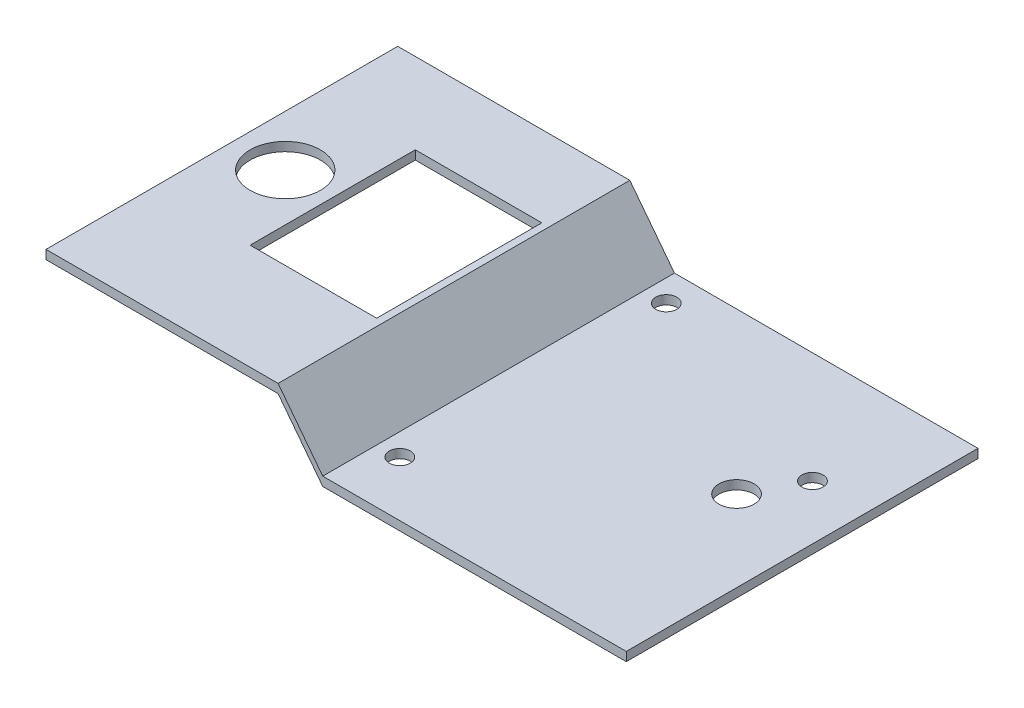
ISO-10303-21;
HEADER;
FILE_DESCRIPTION(('STEP AP214'),'2;1');
FILE_NAME('part.step','',(''),(''),'','','');
FILE_SCHEMA(('AUTOMOTIVE_DESIGN { 1 0 10303 214 1 1 1 1 }'));
ENDSEC;
DATA;
#1=APPLICATION_CONTEXT('core data for automotive mechanical design processes');
#2=APPLICATION_PROTOCOL_DEFINITION('international standard','automotive_design',2000,#1);
#3=PRODUCT_CONTEXT('',#1,'mechanical');
#4=PRODUCT('Part','Part','',(#3));
#5=PRODUCT_RELATED_PRODUCT_CATEGORY('part','',(#4));
#6=PRODUCT_DEFINITION_FORMATION('','',#4);
#7=PRODUCT_DEFINITION_CONTEXT('part definition',#1,'design');
#8=PRODUCT_DEFINITION('design','',#6,#7);
#9=PRODUCT_DEFINITION_SHAPE('','',#8);
#10=(LENGTH_UNIT() NAMED_UNIT(*) SI_UNIT(.MILLI.,.METRE.));
#11=(NAMED_UNIT(*) PLANE_ANGLE_UNIT() SI_UNIT($,.RADIAN.));
#12=(NAMED_UNIT(*) SI_UNIT($,.STERADIAN.) SOLID_ANGLE_UNIT());
#13=UNCERTAINTY_MEASURE_WITH_UNIT(LENGTH_MEASURE(1.E-05),#10,'distance_accuracy_value','');
#14=(GEOMETRIC_REPRESENTATION_CONTEXT(3) GLOBAL_UNCERTAINTY_ASSIGNED_CONTEXT((#13)) GLOBAL_UNIT_ASSIGNED_CONTEXT((#10,
#11,#12)) REPRESENTATION_CONTEXT('',''));
#15=CARTESIAN_POINT('',(0.,0.,0.));
#16=DIRECTION('',(0.,0.,1.));
#17=DIRECTION('',(1.,0.,0.));
#18=AXIS2_PLACEMENT_3D('',#15,#16,#17);
#19=CARTESIAN_POINT('',(0.,-13.97,99.06));
#20=DIRECTION('',(0.,-1.,0.));
#21=DIRECTION('',(0.,0.,-1.));
#22=AXIS2_PLACEMENT_3D('',#19,#20,#21);
#23=PLANE('',#22);
#24=CARTESIAN_POINT('',(149.6,-13.97,30.584));
#25=DIRECTION('',(0.,-1.,0.));
#26=DIRECTION('',(0.,0.,-1.));
#27=AXIS2_PLACEMENT_3D('',#24,#25,#26);
#28=CIRCLE('',#27,2.99999999999999);
#29=CARTESIAN_POINT('',(149.6,-13.97,33.584));
#30=VERTEX_POINT('',#29);
#31=EDGE_CURVE('E163',#30,#30,#28,.T.);
#32=ORIENTED_EDGE('',*,*,#31,.T.);
#33=EDGE_LOOP('',(#32));
#34=FACE_BOUND('',#33,.T.);
#35=CARTESIAN_POINT('',(85.,-13.97,83.384));
#36=DIRECTION('',(0.,-1.,0.));
#37=DIRECTION('',(0.,0.,-1.));
#38=AXIS2_PLACEMENT_3D('',#35,#36,#37);
#39=CIRCLE('',#38,3.00000000000001);
#40=CARTESIAN_POINT('',(85.,-13.97,86.384));
#41=VERTEX_POINT('',#40);
#42=EDGE_CURVE('E160',#41,#41,#39,.T.);
#43=ORIENTED_EDGE('',*,*,#42,.T.);
#44=EDGE_LOOP('',(#43));
#45=FACE_BOUND('',#44,.T.);
#46=CARTESIAN_POINT('',(85.,-13.97,7.58399999999999));
#47=DIRECTION('',(0.,-1.,0.));
#48=DIRECTION('',(0.,0.,-1.));
#49=AXIS2_PLACEMENT_3D('',#46,#47,#48);
#50=CIRCLE('',#49,3.00000000000001);
#51=CARTESIAN_POINT('',(85.,-13.97,10.584));
#52=VERTEX_POINT('',#51);
#53=EDGE_CURVE('E157',#52,#52,#50,.T.);
#54=ORIENTED_EDGE('',*,*,#53,.T.);
#55=EDGE_LOOP('',(#54));
#56=FACE_BOUND('',#55,.T.);
#57=CARTESIAN_POINT('',(142.,-13.97,44.584));
#58=DIRECTION('',(0.,-1.,0.));
#59=DIRECTION('',(0.,0.,-1.));
#60=AXIS2_PLACEMENT_3D('',#57,#58,#59);
#61=CIRCLE('',#60,4.99999999999999);
#62=CARTESIAN_POINT('',(142.,-13.97,49.584));
#63=VERTEX_POINT('',#62);
#64=EDGE_CURVE('E152',#63,#63,#61,.T.);
#65=ORIENTED_EDGE('',*,*,#64,.T.);
#66=EDGE_LOOP('',(#65));
#67=FACE_BOUND('',#66,.T.);
#68=DIRECTION('',(0.,0.,-1.));
#69=VECTOR('',#68,1.);
#70=CARTESIAN_POINT('',(165.1,-13.97,99.06));
#71=LINE('',#70,#69);
#72=CARTESIAN_POINT('',(165.1,-13.97,99.06));
#73=VERTEX_POINT('',#72);
#74=CARTESIAN_POINT('',(165.1,-13.97,-1.016));
#75=VERTEX_POINT('',#74);
#76=EDGE_CURVE('E209',#73,#75,#71,.T.);
#77=ORIENTED_EDGE('',*,*,#76,.T.);
#78=DIRECTION('',(-1.,0.,0.));
#79=VECTOR('',#78,1.);
#80=CARTESIAN_POINT('',(0.,-13.97,-1.016));
#81=LINE('',#80,#79);
#82=CARTESIAN_POINT('',(78.74,-13.97,-1.016));
#83=VERTEX_POINT('',#82);
#84=EDGE_CURVE('E166',#75,#83,#81,.T.);
#85=ORIENTED_EDGE('',*,*,#84,.T.);
#86=DIRECTION('',(0.,0.,-1.));
#87=VECTOR('',#86,1.);
#88=CARTESIAN_POINT('',(78.74,-13.97,99.06));
#89=LINE('',#88,#87);
#90=CARTESIAN_POINT('',(78.74,-13.97,99.06));
#91=VERTEX_POINT('',#90);
#92=EDGE_CURVE('E223',#91,#83,#89,.T.);
#93=ORIENTED_EDGE('',*,*,#92,.F.);
#94=DIRECTION('',(-1.,0.,0.));
#95=VECTOR('',#94,1.);
#96=CARTESIAN_POINT('',(0.,-13.97,99.06));
#97=LINE('',#96,#95);
#98=EDGE_CURVE('E190',#73,#91,#97,.T.);
#99=ORIENTED_EDGE('',*,*,#98,.F.);
#100=EDGE_LOOP('',(#77,#85,#93,#99));
#101=FACE_BOUND('',#100,.T.);
#102=ADVANCED_FACE('F37',(#34,#45,#56,#67,#101),#23,.F.);
#103=CARTESIAN_POINT('',(42.7173234200743,32.8594795539033,99.06));
#104=DIRECTION('',(-0.7926239891046,-0.609710760849692,0.));
#105=DIRECTION('',(0.609710760849692,-0.7926239891046,0.));
#106=AXIS2_PLACEMENT_3D('',#103,#104,#105);
#107=PLANE('',#106);
#108=ORIENTED_EDGE('',*,*,#92,.T.);
#109=DIRECTION('',(-0.609710760849692,0.7926239891046,0.));
#110=VECTOR('',#109,1.);
#111=CARTESIAN_POINT('',(42.7173234200743,32.8594795539033,-1.016));
#112=LINE('',#111,#110);
#113=CARTESIAN_POINT('',(66.04,2.54,-1.016));
#114=VERTEX_POINT('',#113);
#115=EDGE_CURVE('E169',#83,#114,#112,.T.);
#116=ORIENTED_EDGE('',*,*,#115,.T.);
#117=DIRECTION('',(0.,0.,-1.));
#118=VECTOR('',#117,1.);
#119=CARTESIAN_POINT('',(66.04,2.54,99.06));
#120=LINE('',#119,#118);
#121=CARTESIAN_POINT('',(66.04,2.54,99.06));
#122=VERTEX_POINT('',#121);
#123=EDGE_CURVE('E221',#122,#114,#120,.T.);
#124=ORIENTED_EDGE('',*,*,#123,.F.);
#125=DIRECTION('',(-0.609710760849692,0.7926239891046,0.));
#126=VECTOR('',#125,1.);
#127=CARTESIAN_POINT('',(42.7173234200743,32.8594795539033,99.06));
#128=LINE('',#127,#126);
#129=EDGE_CURVE('E193',#91,#122,#128,.T.);
#130=ORIENTED_EDGE('',*,*,#129,.F.);
#131=EDGE_LOOP('',(#108,#116,#124,#130));
#132=FACE_BOUND('',#131,.T.);
#133=ADVANCED_FACE('F250',(#132),#107,.F.);
#134=CARTESIAN_POINT('',(0.,2.54,99.06));
#135=DIRECTION('',(0.,1.,0.));
#136=DIRECTION('',(0.,0.,1.));
#137=AXIS2_PLACEMENT_3D('',#134,#135,#136);
#138=PLANE('',#137);
#139=CARTESIAN_POINT('',(14.5,2.54,45.484));
#140=DIRECTION('',(0.,1.,0.));
#141=DIRECTION('',(0.,0.,1.));
#142=AXIS2_PLACEMENT_3D('',#139,#140,#141);
#143=CIRCLE('',#142,10.);
#144=CARTESIAN_POINT('',(14.5,2.54,55.484));
#145=VERTEX_POINT('',#144);
#146=EDGE_CURVE('E456',#145,#145,#143,.T.);
#147=ORIENTED_EDGE('',*,*,#146,.F.);
#148=EDGE_LOOP('',(#147));
#149=FACE_BOUND('',#148,.T.);
#150=DIRECTION('',(0.,0.,-1.));
#151=VECTOR('',#150,1.);
#152=CARTESIAN_POINT('',(64.,2.54,68.984));
#153=LINE('',#152,#151);
#154=CARTESIAN_POINT('',(64.,2.54,68.984));
#155=VERTEX_POINT('',#154);
#156=CARTESIAN_POINT('',(64.,2.54,21.984));
#157=VERTEX_POINT('',#156);
#158=EDGE_CURVE('E52',#155,#157,#153,.T.);
#159=ORIENTED_EDGE('',*,*,#158,.F.);
#160=DIRECTION('',(1.,0.,0.));
#161=VECTOR('',#160,1.);
#162=CARTESIAN_POINT('',(28.,2.54,68.984));
#163=LINE('',#162,#161);
#164=CARTESIAN_POINT('',(28.,2.54,68.984));
#165=VERTEX_POINT('',#164);
#166=EDGE_CURVE('E145',#165,#155,#163,.T.);
#167=ORIENTED_EDGE('',*,*,#166,.F.);
#168=DIRECTION('',(0.,0.,1.));
#169=VECTOR('',#168,1.);
#170=CARTESIAN_POINT('',(28.,2.54,68.984));
#171=LINE('',#170,#169);
#172=CARTESIAN_POINT('',(28.,2.54,21.984));
#173=VERTEX_POINT('',#172);
#174=EDGE_CURVE('E129',#173,#165,#171,.T.);
#175=ORIENTED_EDGE('',*,*,#174,.F.);
#176=DIRECTION('',(-1.,0.,0.));
#177=VECTOR('',#176,1.);
#178=CARTESIAN_POINT('',(28.,2.54,21.984));
#179=LINE('',#178,#177);
#180=EDGE_CURVE('E138',#157,#173,#179,.T.);
#181=ORIENTED_EDGE('',*,*,#180,.F.);
#182=EDGE_LOOP('',(#159,#167,#175,#181));
#183=FACE_BOUND('',#182,.T.);
#184=ORIENTED_EDGE('',*,*,#123,.T.);
#185=DIRECTION('',(1.,0.,0.));
#186=VECTOR('',#185,1.);
#187=CARTESIAN_POINT('',(0.,2.54,-1.016));
#188=LINE('',#187,#186);
#189=CARTESIAN_POINT('',(0.,2.54,-1.016));
#190=VERTEX_POINT('',#189);
#191=EDGE_CURVE('E172',#190,#114,#188,.T.);
#192=ORIENTED_EDGE('',*,*,#191,.F.);
#193=DIRECTION('',(0.,0.,-1.));
#194=VECTOR('',#193,1.);
#195=CARTESIAN_POINT('',(0.,2.54,99.06));
#196=LINE('',#195,#194);
#197=CARTESIAN_POINT('',(0.,2.54,99.06));
#198=VERTEX_POINT('',#197);
#199=EDGE_CURVE('E219',#198,#190,#196,.T.);
#200=ORIENTED_EDGE('',*,*,#199,.F.);
#201=DIRECTION('',(1.,0.,0.));
#202=VECTOR('',#201,1.);
#203=CARTESIAN_POINT('',(0.,2.54,99.06));
#204=LINE('',#203,#202);
#205=EDGE_CURVE('E195',#198,#122,#204,.T.);
#206=ORIENTED_EDGE('',*,*,#205,.T.);
#207=EDGE_LOOP('',(#184,#192,#200,#206));
#208=FACE_BOUND('',#207,.T.);
#209=ADVANCED_FACE('F142',(#149,#183,#208),#138,.T.);
#210=CARTESIAN_POINT('',(0.,0.,99.06));
#211=DIRECTION('',(-1.,0.,0.));
#212=DIRECTION('',(0.,0.,1.));
#213=AXIS2_PLACEMENT_3D('',#210,#211,#212);
#214=PLANE('',#213);
#215=ORIENTED_EDGE('',*,*,#199,.T.);
#216=DIRECTION('',(0.,1.,0.));
#217=VECTOR('',#216,1.);
#218=CARTESIAN_POINT('',(0.,0.,-1.016));
#219=LINE('',#218,#217);
#220=CARTESIAN_POINT('',(0.,0.,-1.016));
#221=VERTEX_POINT('',#220);
#222=EDGE_CURVE('E175',#221,#190,#219,.T.);
#223=ORIENTED_EDGE('',*,*,#222,.F.);
#224=DIRECTION('',(0.,0.,-1.));
#225=VECTOR('',#224,1.);
#226=CARTESIAN_POINT('',(0.,0.,99.06));
#227=LINE('',#226,#225);
#228=CARTESIAN_POINT('',(0.,0.,99.06));
#229=VERTEX_POINT('',#228);
#230=EDGE_CURVE('E217',#229,#221,#227,.T.);
#231=ORIENTED_EDGE('',*,*,#230,.F.);
#232=DIRECTION('',(0.,1.,0.));
#233=VECTOR('',#232,1.);
#234=CARTESIAN_POINT('',(0.,0.,99.06));
#235=LINE('',#234,#233);
#236=EDGE_CURVE('E198',#229,#198,#235,.T.);
#237=ORIENTED_EDGE('',*,*,#236,.T.);
#238=EDGE_LOOP('',(#215,#223,#231,#237));
#239=FACE_BOUND('',#238,.T.);
#240=ADVANCED_FACE('F296',(#239),#214,.T.);
#241=CARTESIAN_POINT('',(0.,0.,99.06));
#242=DIRECTION('',(0.,1.,0.));
#243=DIRECTION('',(0.,0.,1.));
#244=AXIS2_PLACEMENT_3D('',#241,#242,#243);
#245=PLANE('',#244);
#246=CARTESIAN_POINT('',(14.5,0.,45.484));
#247=DIRECTION('',(0.,1.,0.));
#248=DIRECTION('',(0.,0.,1.));
#249=AXIS2_PLACEMENT_3D('',#246,#247,#248);
#250=CIRCLE('',#249,10.);
#251=CARTESIAN_POINT('',(14.5,0.,55.484));
#252=VERTEX_POINT('',#251);
#253=EDGE_CURVE('E40',#252,#252,#250,.T.);
#254=ORIENTED_EDGE('',*,*,#253,.T.);
#255=EDGE_LOOP('',(#254));
#256=FACE_BOUND('',#255,.T.);
#257=DIRECTION('',(1.,0.,0.));
#258=VECTOR('',#257,1.);
#259=CARTESIAN_POINT('',(0.,0.,68.984));
#260=LINE('',#259,#258);
#261=CARTESIAN_POINT('',(28.,0.,68.984));
#262=VERTEX_POINT('',#261);
#263=CARTESIAN_POINT('',(64.,0.,68.984));
#264=VERTEX_POINT('',#263);
#265=EDGE_CURVE('E45',#262,#264,#260,.T.);
#266=ORIENTED_EDGE('',*,*,#265,.T.);
#267=DIRECTION('',(0.,0.,-1.));
#268=VECTOR('',#267,1.);
#269=CARTESIAN_POINT('',(64.,0.,99.06));
#270=LINE('',#269,#268);
#271=CARTESIAN_POINT('',(64.,0.,21.984));
#272=VERTEX_POINT('',#271);
#273=EDGE_CURVE('E11',#264,#272,#270,.T.);
#274=ORIENTED_EDGE('',*,*,#273,.T.);
#275=DIRECTION('',(-1.,0.,0.));
#276=VECTOR('',#275,1.);
#277=CARTESIAN_POINT('',(0.,0.,21.984));
#278=LINE('',#277,#276);
#279=CARTESIAN_POINT('',(28.,0.,21.984));
#280=VERTEX_POINT('',#279);
#281=EDGE_CURVE('E225',#272,#280,#278,.T.);
#282=ORIENTED_EDGE('',*,*,#281,.T.);
#283=DIRECTION('',(0.,0.,1.));
#284=VECTOR('',#283,1.);
#285=CARTESIAN_POINT('',(28.,0.,99.06));
#286=LINE('',#285,#284);
#287=EDGE_CURVE('E132',#280,#262,#286,.T.);
#288=ORIENTED_EDGE('',*,*,#287,.T.);
#289=EDGE_LOOP('',(#266,#274,#282,#288));
#290=FACE_BOUND('',#289,.T.);
#291=ORIENTED_EDGE('',*,*,#230,.T.);
#292=DIRECTION('',(1.,0.,0.));
#293=VECTOR('',#292,1.);
#294=CARTESIAN_POINT('',(0.,0.,-1.016));
#295=LINE('',#294,#293);
#296=CARTESIAN_POINT('',(66.04,0.,-1.016));
#297=VERTEX_POINT('',#296);
#298=EDGE_CURVE('E178',#221,#297,#295,.T.);
#299=ORIENTED_EDGE('',*,*,#298,.T.);
#300=DIRECTION('',(0.,0.,-1.));
#301=VECTOR('',#300,1.);
#302=CARTESIAN_POINT('',(66.04,0.,99.06));
#303=LINE('',#302,#301);
#304=CARTESIAN_POINT('',(66.04,0.,99.06));
#305=VERTEX_POINT('',#304);
#306=EDGE_CURVE('E215',#305,#297,#303,.T.);
#307=ORIENTED_EDGE('',*,*,#306,.F.);
#308=DIRECTION('',(1.,0.,0.));
#309=VECTOR('',#308,1.);
#310=CARTESIAN_POINT('',(0.,0.,99.06));
#311=LINE('',#310,#309);
#312=EDGE_CURVE('E201',#229,#305,#311,.T.);
#313=ORIENTED_EDGE('',*,*,#312,.F.);
#314=EDGE_LOOP('',(#291,#299,#307,#313));
#315=FACE_BOUND('',#314,.T.);
#316=ADVANCED_FACE('F230',(#256,#290,#315),#245,.F.);
#317=CARTESIAN_POINT('',(41.489814126394,31.9152416356877,99.06));
#318=DIRECTION('',(0.7926239891046,0.609710760849692,0.));
#319=DIRECTION('',(-0.609710760849692,0.7926239891046,0.));
#320=AXIS2_PLACEMENT_3D('',#317,#318,#319);
#321=PLANE('',#320);
#322=ORIENTED_EDGE('',*,*,#306,.T.);
#323=DIRECTION('',(0.609710760849692,-0.7926239891046,0.));
#324=VECTOR('',#323,1.);
#325=CARTESIAN_POINT('',(41.489814126394,31.9152416356877,-1.016));
#326=LINE('',#325,#324);
#327=CARTESIAN_POINT('',(78.74,-16.51,-1.016));
#328=VERTEX_POINT('',#327);
#329=EDGE_CURVE('E181',#297,#328,#326,.T.);
#330=ORIENTED_EDGE('',*,*,#329,.T.);
#331=DIRECTION('',(0.,0.,-1.));
#332=VECTOR('',#331,1.);
#333=CARTESIAN_POINT('',(78.74,-16.51,99.06));
#334=LINE('',#333,#332);
#335=CARTESIAN_POINT('',(78.74,-16.51,99.06));
#336=VERTEX_POINT('',#335);
#337=EDGE_CURVE('E213',#336,#328,#334,.T.);
#338=ORIENTED_EDGE('',*,*,#337,.F.);
#339=DIRECTION('',(0.609710760849692,-0.7926239891046,0.));
#340=VECTOR('',#339,1.);
#341=CARTESIAN_POINT('',(41.489814126394,31.9152416356877,99.06));
#342=LINE('',#341,#340);
#343=EDGE_CURVE('E203',#305,#336,#342,.T.);
#344=ORIENTED_EDGE('',*,*,#343,.F.);
#345=EDGE_LOOP('',(#322,#330,#338,#344));
#346=FACE_BOUND('',#345,.T.);
#347=ADVANCED_FACE('F284',(#346),#321,.F.);
#348=CARTESIAN_POINT('',(0.,-16.51,99.06));
#349=DIRECTION('',(0.,1.,0.));
#350=DIRECTION('',(0.,0.,1.));
#351=AXIS2_PLACEMENT_3D('',#348,#349,#350);
#352=PLANE('',#351);
#353=CARTESIAN_POINT('',(149.6,-16.51,30.584));
#354=DIRECTION('',(0.,1.,0.));
#355=DIRECTION('',(0.,0.,1.));
#356=AXIS2_PLACEMENT_3D('',#353,#354,#355);
#357=CIRCLE('',#356,2.99999999999999);
#358=CARTESIAN_POINT('',(149.6,-16.51,33.584));
#359=VERTEX_POINT('',#358);
#360=EDGE_CURVE('E451',#359,#359,#357,.T.);
#361=ORIENTED_EDGE('',*,*,#360,.T.);
#362=EDGE_LOOP('',(#361));
#363=FACE_BOUND('',#362,.T.);
#364=CARTESIAN_POINT('',(85.,-16.51,83.384));
#365=DIRECTION('',(0.,1.,0.));
#366=DIRECTION('',(0.,0.,-1.));
#367=AXIS2_PLACEMENT_3D('',#364,#365,#366);
#368=CIRCLE('',#367,3.00000000000001);
#369=CARTESIAN_POINT('',(85.,-16.51,86.384));
#370=VERTEX_POINT('',#369);
#371=EDGE_CURVE('E448',#370,#370,#368,.T.);
#372=ORIENTED_EDGE('',*,*,#371,.T.);
#373=EDGE_LOOP('',(#372));
#374=FACE_BOUND('',#373,.T.);
#375=CARTESIAN_POINT('',(85.,-16.51,7.58399999999999));
#376=DIRECTION('',(0.,1.,0.));
#377=DIRECTION('',(0.,0.,1.));
#378=AXIS2_PLACEMENT_3D('',#375,#376,#377);
#379=CIRCLE('',#378,3.00000000000001);
#380=CARTESIAN_POINT('',(85.,-16.51,10.584));
#381=VERTEX_POINT('',#380);
#382=EDGE_CURVE('E450',#381,#381,#379,.T.);
#383=ORIENTED_EDGE('',*,*,#382,.T.);
#384=EDGE_LOOP('',(#383));
#385=FACE_BOUND('',#384,.T.);
#386=CARTESIAN_POINT('',(142.,-16.51,44.584));
#387=DIRECTION('',(0.,1.,0.));
#388=DIRECTION('',(0.,0.,1.));
#389=AXIS2_PLACEMENT_3D('',#386,#387,#388);
#390=CIRCLE('',#389,4.99999999999999);
#391=CARTESIAN_POINT('',(142.,-16.51,49.584));
#392=VERTEX_POINT('',#391);
#393=EDGE_CURVE('E460',#392,#392,#390,.T.);
#394=ORIENTED_EDGE('',*,*,#393,.T.);
#395=EDGE_LOOP('',(#394));
#396=FACE_BOUND('',#395,.T.);
#397=ORIENTED_EDGE('',*,*,#337,.T.);
#398=DIRECTION('',(1.,0.,0.));
#399=VECTOR('',#398,1.);
#400=CARTESIAN_POINT('',(0.,-16.51,-1.016));
#401=LINE('',#400,#399);
#402=CARTESIAN_POINT('',(165.1,-16.51,-1.016));
#403=VERTEX_POINT('',#402);
#404=EDGE_CURVE('E184',#328,#403,#401,.T.);
#405=ORIENTED_EDGE('',*,*,#404,.T.);
#406=DIRECTION('',(0.,0.,-1.));
#407=VECTOR('',#406,1.);
#408=CARTESIAN_POINT('',(165.1,-16.51,99.06));
#409=LINE('',#408,#407);
#410=CARTESIAN_POINT('',(165.1,-16.51,99.06));
#411=VERTEX_POINT('',#410);
#412=EDGE_CURVE('E211',#411,#403,#409,.T.);
#413=ORIENTED_EDGE('',*,*,#412,.F.);
#414=DIRECTION('',(1.,0.,0.));
#415=VECTOR('',#414,1.);
#416=CARTESIAN_POINT('',(0.,-16.51,99.06));
#417=LINE('',#416,#415);
#418=EDGE_CURVE('E205',#336,#411,#417,.T.);
#419=ORIENTED_EDGE('',*,*,#418,.F.);
#420=EDGE_LOOP('',(#397,#405,#413,#419));
#421=FACE_BOUND('',#420,.T.);
#422=ADVANCED_FACE('F279',(#363,#374,#385,#396,#421),#352,.F.);
#423=CARTESIAN_POINT('',(165.1,0.,99.06));
#424=DIRECTION('',(-1.,0.,0.));
#425=DIRECTION('',(0.,0.,1.));
#426=AXIS2_PLACEMENT_3D('',#423,#424,#425);
#427=PLANE('',#426);
#428=ORIENTED_EDGE('',*,*,#412,.T.);
#429=DIRECTION('',(0.,1.,0.));
#430=VECTOR('',#429,1.);
#431=CARTESIAN_POINT('',(165.1,0.,-1.016));
#432=LINE('',#431,#430);
#433=EDGE_CURVE('E187',#403,#75,#432,.T.);
#434=ORIENTED_EDGE('',*,*,#433,.T.);
#435=ORIENTED_EDGE('',*,*,#76,.F.);
#436=DIRECTION('',(0.,1.,0.));
#437=VECTOR('',#436,1.);
#438=CARTESIAN_POINT('',(165.1,0.,99.06));
#439=LINE('',#438,#437);
#440=EDGE_CURVE('E207',#411,#73,#439,.T.);
#441=ORIENTED_EDGE('',*,*,#440,.F.);
#442=EDGE_LOOP('',(#428,#434,#435,#441));
#443=FACE_BOUND('',#442,.T.);
#444=ADVANCED_FACE('F275',(#443),#427,.F.);
#445=CARTESIAN_POINT('',(0.,0.,99.06));
#446=DIRECTION('',(0.,0.,1.));
#447=DIRECTION('',(1.,0.,0.));
#448=AXIS2_PLACEMENT_3D('',#445,#446,#447);
#449=PLANE('',#448);
#450=ORIENTED_EDGE('',*,*,#98,.T.);
#451=ORIENTED_EDGE('',*,*,#129,.T.);
#452=ORIENTED_EDGE('',*,*,#205,.F.);
#453=ORIENTED_EDGE('',*,*,#236,.F.);
#454=ORIENTED_EDGE('',*,*,#312,.T.);
#455=ORIENTED_EDGE('',*,*,#343,.T.);
#456=ORIENTED_EDGE('',*,*,#418,.T.);
#457=ORIENTED_EDGE('',*,*,#440,.T.);
#458=EDGE_LOOP('',(#450,#451,#452,#453,#454,#455,#456,#457));
#459=FACE_BOUND('',#458,.T.);
#460=ADVANCED_FACE('F295',(#459),#449,.T.);
#461=CARTESIAN_POINT('',(0.,0.,-1.016));
#462=DIRECTION('',(0.,0.,1.));
#463=DIRECTION('',(1.,0.,0.));
#464=AXIS2_PLACEMENT_3D('',#461,#462,#463);
#465=PLANE('',#464);
#466=ORIENTED_EDGE('',*,*,#84,.F.);
#467=ORIENTED_EDGE('',*,*,#433,.F.);
#468=ORIENTED_EDGE('',*,*,#404,.F.);
#469=ORIENTED_EDGE('',*,*,#329,.F.);
#470=ORIENTED_EDGE('',*,*,#298,.F.);
#471=ORIENTED_EDGE('',*,*,#222,.T.);
#472=ORIENTED_EDGE('',*,*,#191,.T.);
#473=ORIENTED_EDGE('',*,*,#115,.F.);
#474=EDGE_LOOP('',(#466,#467,#468,#469,#470,#471,#472,#473));
#475=FACE_BOUND('',#474,.T.);
#476=ADVANCED_FACE('F273',(#475),#465,.F.);
#477=CARTESIAN_POINT('',(142.,-16.51,44.584));
#478=DIRECTION('',(0.,1.,0.));
#479=DIRECTION('',(0.,0.,1.));
#480=AXIS2_PLACEMENT_3D('',#477,#478,#479);
#481=CYLINDRICAL_SURFACE('',#480,4.99999999999999);
#482=CARTESIAN_POINT('',(142.,-16.51,49.584));
#483=CARTESIAN_POINT('',(142.,-16.4835416666667,49.584));
#484=CARTESIAN_POINT('',(142.,-16.4570833333333,49.584));
#485=CARTESIAN_POINT('',(142.,-16.4041666666667,49.584));
#486=CARTESIAN_POINT('',(142.,-16.3777083333333,49.584));
#487=CARTESIAN_POINT('',(142.,-16.3247916666667,49.584));
#488=CARTESIAN_POINT('',(142.,-16.2983333333333,49.584));
#489=CARTESIAN_POINT('',(142.,-16.2454166666667,49.584));
#490=CARTESIAN_POINT('',(142.,-16.2189583333333,49.584));
#491=CARTESIAN_POINT('',(142.,-16.1660416666667,49.584));
#492=CARTESIAN_POINT('',(142.,-16.1395833333333,49.584));
#493=CARTESIAN_POINT('',(142.,-16.0866666666667,49.584));
#494=CARTESIAN_POINT('',(142.,-16.0602083333333,49.584));
#495=CARTESIAN_POINT('',(142.,-16.0072916666667,49.584));
#496=CARTESIAN_POINT('',(142.,-15.9808333333333,49.584));
#497=CARTESIAN_POINT('',(142.,-15.9279166666667,49.584));
#498=CARTESIAN_POINT('',(142.,-15.9014583333333,49.584));
#499=CARTESIAN_POINT('',(142.,-15.8485416666667,49.584));
#500=CARTESIAN_POINT('',(142.,-15.8220833333333,49.584));
#501=CARTESIAN_POINT('',(142.,-15.7691666666667,49.584));
#502=CARTESIAN_POINT('',(142.,-15.7427083333333,49.584));
#503=CARTESIAN_POINT('',(142.,-15.6897916666667,49.584));
#504=CARTESIAN_POINT('',(142.,-15.6633333333333,49.584));
#505=CARTESIAN_POINT('',(142.,-15.6104166666667,49.584));
#506=CARTESIAN_POINT('',(142.,-15.5839583333333,49.584));
#507=CARTESIAN_POINT('',(142.,-15.5310416666667,49.584));
#508=CARTESIAN_POINT('',(142.,-15.5045833333333,49.584));
#509=CARTESIAN_POINT('',(142.,-15.4516666666667,49.584));
#510=CARTESIAN_POINT('',(142.,-15.4252083333333,49.584));
#511=CARTESIAN_POINT('',(142.,-15.3722916666667,49.584));
#512=CARTESIAN_POINT('',(142.,-15.3458333333333,49.584));
#513=CARTESIAN_POINT('',(142.,-15.2929166666667,49.584));
#514=CARTESIAN_POINT('',(142.,-15.2664583333333,49.584));
#515=CARTESIAN_POINT('',(142.,-15.2135416666667,49.584));
#516=CARTESIAN_POINT('',(142.,-15.1870833333333,49.584));
#517=CARTESIAN_POINT('',(142.,-15.1341666666667,49.584));
#518=CARTESIAN_POINT('',(142.,-15.1077083333333,49.584));
#519=CARTESIAN_POINT('',(142.,-15.0547916666667,49.584));
#520=CARTESIAN_POINT('',(142.,-15.0283333333333,49.584));
#521=CARTESIAN_POINT('',(142.,-14.9754166666667,49.584));
#522=CARTESIAN_POINT('',(142.,-14.9489583333333,49.584));
#523=CARTESIAN_POINT('',(142.,-14.8960416666667,49.584));
#524=CARTESIAN_POINT('',(142.,-14.8695833333333,49.584));
#525=CARTESIAN_POINT('',(142.,-14.8166666666667,49.584));
#526=CARTESIAN_POINT('',(142.,-14.7902083333333,49.584));
#527=CARTESIAN_POINT('',(142.,-14.7372916666667,49.584));
#528=CARTESIAN_POINT('',(142.,-14.7108333333333,49.584));
#529=CARTESIAN_POINT('',(142.,-14.6579166666667,49.584));
#530=CARTESIAN_POINT('',(142.,-14.6314583333333,49.584));
#531=CARTESIAN_POINT('',(142.,-14.5785416666667,49.584));
#532=CARTESIAN_POINT('',(142.,-14.5520833333333,49.584));
#533=CARTESIAN_POINT('',(142.,-14.4991666666667,49.584));
#534=CARTESIAN_POINT('',(142.,-14.4727083333333,49.584));
#535=CARTESIAN_POINT('',(142.,-14.4197916666667,49.584));
#536=CARTESIAN_POINT('',(142.,-14.3933333333333,49.584));
#537=CARTESIAN_POINT('',(142.,-14.3404166666667,49.584));
#538=CARTESIAN_POINT('',(142.,-14.3139583333333,49.584));
#539=CARTESIAN_POINT('',(142.,-14.2610416666667,49.584));
#540=CARTESIAN_POINT('',(142.,-14.2345833333333,49.584));
#541=CARTESIAN_POINT('',(142.,-14.1816666666667,49.584));
#542=CARTESIAN_POINT('',(142.,-14.1552083333333,49.584));
#543=CARTESIAN_POINT('',(142.,-14.1022916666667,49.584));
#544=CARTESIAN_POINT('',(142.,-14.0758333333333,49.584));
#545=CARTESIAN_POINT('',(142.,-14.0229166666667,49.584));
#546=CARTESIAN_POINT('',(142.,-13.9964583333333,49.584));
#547=CARTESIAN_POINT('',(142.,-13.97,49.584));
#548=B_SPLINE_CURVE_WITH_KNOTS('',3,(#482,#483,#484,#485,#486,#487,#488,#489,#490,#491,#492,
#493,#494,#495,#496,#497,#498,#499,#500,#501,#502,#503,#504,#505,#506,#507,#508,#509,#510,#511,
#512,#513,#514,#515,#516,#517,#518,#519,#520,#521,#522,#523,#524,#525,#526,#527,#528,#529,#530,
#531,#532,#533,#534,#535,#536,#537,#538,#539,#540,#541,#542,#543,#544,#545,#546,#547),
.UNSPECIFIED.,.F.,.F.,(4,2,2,2,2,2,2,2,2,2,2,2,2,2,2,2,2,2,2,2,2,2,2,2,2,2,2,2,2,2,2,2,4),(0.,
0.0793749999999996,0.158749999999999,0.238124999999999,0.317499999999998,0.396874999999998,
0.476249999999998,0.555625000000001,0.635,0.714375,0.793749999999999,0.873124999999999,0.9525,
1.031875,1.11125,1.190625,1.27,1.349375,1.42875,1.508125,1.5875,1.666875,1.74625,1.825625,1.905,
1.984375,2.06375,2.143125,2.2225,2.301875,2.38125,2.460625,2.54),.UNSPECIFIED.);
#549=EDGE_CURVE('BSEAM317',#392,#63,#548,.T.);
#550=ORIENTED_EDGE('',*,*,#393,.F.);
#551=ORIENTED_EDGE('',*,*,#64,.F.);
#552=ORIENTED_EDGE('',*,*,#549,.T.);
#553=ORIENTED_EDGE('',*,*,#549,.F.);
#554=EDGE_LOOP('',(#550,#552,#551,#553));
#555=FACE_BOUND('',#554,.T.);
#556=ADVANCED_FACE('F317',(#555),#481,.F.);
#557=CARTESIAN_POINT('',(85.,-16.51,7.58399999999999));
#558=DIRECTION('',(0.,1.,0.));
#559=DIRECTION('',(0.,0.,1.));
#560=AXIS2_PLACEMENT_3D('',#557,#558,#559);
#561=CYLINDRICAL_SURFACE('',#560,3.00000000000001);
#562=CARTESIAN_POINT('',(85.,-16.51,10.584));
#563=CARTESIAN_POINT('',(85.,-16.4835416666667,10.584));
#564=CARTESIAN_POINT('',(85.,-16.4570833333333,10.584));
#565=CARTESIAN_POINT('',(85.,-16.4041666666667,10.584));
#566=CARTESIAN_POINT('',(85.,-16.3777083333333,10.584));
#567=CARTESIAN_POINT('',(85.,-16.3247916666667,10.584));
#568=CARTESIAN_POINT('',(85.,-16.2983333333333,10.584));
#569=CARTESIAN_POINT('',(85.,-16.2454166666667,10.584));
#570=CARTESIAN_POINT('',(85.,-16.2189583333333,10.584));
#571=CARTESIAN_POINT('',(85.,-16.1660416666667,10.584));
#572=CARTESIAN_POINT('',(85.,-16.1395833333333,10.584));
#573=CARTESIAN_POINT('',(85.,-16.0866666666667,10.584));
#574=CARTESIAN_POINT('',(85.,-16.0602083333333,10.584));
#575=CARTESIAN_POINT('',(85.,-16.0072916666667,10.584));
#576=CARTESIAN_POINT('',(85.,-15.9808333333333,10.584));
#577=CARTESIAN_POINT('',(85.,-15.9279166666667,10.584));
#578=CARTESIAN_POINT('',(85.,-15.9014583333333,10.584));
#579=CARTESIAN_POINT('',(85.,-15.8485416666667,10.584));
#580=CARTESIAN_POINT('',(85.,-15.8220833333333,10.584));
#581=CARTESIAN_POINT('',(85.,-15.7691666666667,10.584));
#582=CARTESIAN_POINT('',(85.,-15.7427083333333,10.584));
#583=CARTESIAN_POINT('',(85.,-15.6897916666667,10.584));
#584=CARTESIAN_POINT('',(85.,-15.6633333333333,10.584));
#585=CARTESIAN_POINT('',(85.,-15.6104166666667,10.584));
#586=CARTESIAN_POINT('',(85.,-15.5839583333333,10.584));
#587=CARTESIAN_POINT('',(85.,-15.5310416666667,10.584));
#588=CARTESIAN_POINT('',(85.,-15.5045833333333,10.584));
#589=CARTESIAN_POINT('',(85.,-15.4516666666667,10.584));
#590=CARTESIAN_POINT('',(85.,-15.4252083333333,10.584));
#591=CARTESIAN_POINT('',(85.,-15.3722916666667,10.584));
#592=CARTESIAN_POINT('',(85.,-15.3458333333333,10.584));
#593=CARTESIAN_POINT('',(85.,-15.2929166666667,10.584));
#594=CARTESIAN_POINT('',(85.,-15.2664583333333,10.584));
#595=CARTESIAN_POINT('',(85.,-15.2135416666667,10.584));
#596=CARTESIAN_POINT('',(85.,-15.1870833333333,10.584));
#597=CARTESIAN_POINT('',(85.,-15.1341666666667,10.584));
#598=CARTESIAN_POINT('',(85.,-15.1077083333333,10.584));
#599=CARTESIAN_POINT('',(85.,-15.0547916666667,10.584));
#600=CARTESIAN_POINT('',(85.,-15.0283333333333,10.584));
#601=CARTESIAN_POINT('',(85.,-14.9754166666667,10.584));
#602=CARTESIAN_POINT('',(85.,-14.9489583333333,10.584));
#603=CARTESIAN_POINT('',(85.,-14.8960416666667,10.584));
#604=CARTESIAN_POINT('',(85.,-14.8695833333333,10.584));
#605=CARTESIAN_POINT('',(85.,-14.8166666666667,10.584));
#606=CARTESIAN_POINT('',(85.,-14.7902083333333,10.584));
#607=CARTESIAN_POINT('',(85.,-14.7372916666667,10.584));
#608=CARTESIAN_POINT('',(85.,-14.7108333333333,10.584));
#609=CARTESIAN_POINT('',(85.,-14.6579166666667,10.584));
#610=CARTESIAN_POINT('',(85.,-14.6314583333333,10.584));
#611=CARTESIAN_POINT('',(85.,-14.5785416666667,10.584));
#612=CARTESIAN_POINT('',(85.,-14.5520833333333,10.584));
#613=CARTESIAN_POINT('',(85.,-14.4991666666667,10.584));
#614=CARTESIAN_POINT('',(85.,-14.4727083333333,10.584));
#615=CARTESIAN_POINT('',(85.,-14.4197916666667,10.584));
#616=CARTESIAN_POINT('',(85.,-14.3933333333333,10.584));
#617=CARTESIAN_POINT('',(85.,-14.3404166666667,10.584));
#618=CARTESIAN_POINT('',(85.,-14.3139583333333,10.584));
#619=CARTESIAN_POINT('',(85.,-14.2610416666667,10.584));
#620=CARTESIAN_POINT('',(85.,-14.2345833333333,10.584));
#621=CARTESIAN_POINT('',(85.,-14.1816666666667,10.584));
#622=CARTESIAN_POINT('',(85.,-14.1552083333333,10.584));
#623=CARTESIAN_POINT('',(85.,-14.1022916666667,10.584));
#624=CARTESIAN_POINT('',(85.,-14.0758333333333,10.584));
#625=CARTESIAN_POINT('',(85.,-14.0229166666667,10.584));
#626=CARTESIAN_POINT('',(85.,-13.9964583333333,10.584));
#627=CARTESIAN_POINT('',(85.,-13.97,10.584));
#628=B_SPLINE_CURVE_WITH_KNOTS('',3,(#562,#563,#564,#565,#566,#567,#568,#569,#570,#571,#572,
#573,#574,#575,#576,#577,#578,#579,#580,#581,#582,#583,#584,#585,#586,#587,#588,#589,#590,#591,
#592,#593,#594,#595,#596,#597,#598,#599,#600,#601,#602,#603,#604,#605,#606,#607,#608,#609,#610,
#611,#612,#613,#614,#615,#616,#617,#618,#619,#620,#621,#622,#623,#624,#625,#626,#627),
.UNSPECIFIED.,.F.,.F.,(4,2,2,2,2,2,2,2,2,2,2,2,2,2,2,2,2,2,2,2,2,2,2,2,2,2,2,2,2,2,2,2,4),(0.,
0.0793750000000031,0.158750000000003,0.238125000000002,0.317500000000002,0.396875000000001,
0.476250000000001,0.555625000000004,0.635000000000004,0.714375000000003,0.793750000000003,
0.873125000000002,0.952500000000004,1.031875,1.11125,1.190625,1.27,1.349375,1.42875,1.508125,
1.5875,1.666875,1.74625,1.825625,1.905,1.984375,2.06375,2.143125,2.22250000000001,
2.30187500000001,2.38125,2.460625,2.54000000000001),.UNSPECIFIED.);
#629=EDGE_CURVE('BSEAM321',#381,#52,#628,.T.);
#630=ORIENTED_EDGE('',*,*,#382,.F.);
#631=ORIENTED_EDGE('',*,*,#53,.F.);
#632=ORIENTED_EDGE('',*,*,#629,.T.);
#633=ORIENTED_EDGE('',*,*,#629,.F.);
#634=EDGE_LOOP('',(#630,#632,#631,#633));
#635=FACE_BOUND('',#634,.T.);
#636=ADVANCED_FACE('F321',(#635),#561,.F.);
#637=CARTESIAN_POINT('',(85.,-16.51,83.384));
#638=DIRECTION('',(0.,1.,0.));
#639=DIRECTION('',(0.,0.,1.));
#640=AXIS2_PLACEMENT_3D('',#637,#638,#639);
#641=CYLINDRICAL_SURFACE('',#640,3.00000000000001);
#642=CARTESIAN_POINT('',(85.,-16.51,86.384));
#643=CARTESIAN_POINT('',(85.,-16.4835416666667,86.384));
#644=CARTESIAN_POINT('',(85.,-16.4570833333333,86.384));
#645=CARTESIAN_POINT('',(85.,-16.4041666666667,86.384));
#646=CARTESIAN_POINT('',(85.,-16.3777083333333,86.384));
#647=CARTESIAN_POINT('',(85.,-16.3247916666667,86.384));
#648=CARTESIAN_POINT('',(85.,-16.2983333333333,86.384));
#649=CARTESIAN_POINT('',(85.,-16.2454166666667,86.384));
#650=CARTESIAN_POINT('',(85.,-16.2189583333333,86.384));
#651=CARTESIAN_POINT('',(85.,-16.1660416666667,86.384));
#652=CARTESIAN_POINT('',(85.,-16.1395833333333,86.384));
#653=CARTESIAN_POINT('',(85.,-16.0866666666667,86.384));
#654=CARTESIAN_POINT('',(85.,-16.0602083333333,86.384));
#655=CARTESIAN_POINT('',(85.,-16.0072916666667,86.384));
#656=CARTESIAN_POINT('',(85.,-15.9808333333333,86.384));
#657=CARTESIAN_POINT('',(85.,-15.9279166666667,86.384));
#658=CARTESIAN_POINT('',(85.,-15.9014583333333,86.384));
#659=CARTESIAN_POINT('',(85.,-15.8485416666667,86.384));
#660=CARTESIAN_POINT('',(85.,-15.8220833333333,86.384));
#661=CARTESIAN_POINT('',(85.,-15.7691666666667,86.384));
#662=CARTESIAN_POINT('',(85.,-15.7427083333333,86.384));
#663=CARTESIAN_POINT('',(85.,-15.6897916666667,86.384));
#664=CARTESIAN_POINT('',(85.,-15.6633333333333,86.384));
#665=CARTESIAN_POINT('',(85.,-15.6104166666667,86.384));
#666=CARTESIAN_POINT('',(85.,-15.5839583333333,86.384));
#667=CARTESIAN_POINT('',(85.,-15.5310416666667,86.384));
#668=CARTESIAN_POINT('',(85.,-15.5045833333333,86.384));
#669=CARTESIAN_POINT('',(85.,-15.4516666666667,86.384));
#670=CARTESIAN_POINT('',(85.,-15.4252083333333,86.384));
#671=CARTESIAN_POINT('',(85.,-15.3722916666667,86.384));
#672=CARTESIAN_POINT('',(85.,-15.3458333333333,86.384));
#673=CARTESIAN_POINT('',(85.,-15.2929166666667,86.384));
#674=CARTESIAN_POINT('',(85.,-15.2664583333333,86.384));
#675=CARTESIAN_POINT('',(85.,-15.2135416666667,86.384));
#676=CARTESIAN_POINT('',(85.,-15.1870833333333,86.384));
#677=CARTESIAN_POINT('',(85.,-15.1341666666667,86.384));
#678=CARTESIAN_POINT('',(85.,-15.1077083333333,86.384));
#679=CARTESIAN_POINT('',(85.,-15.0547916666667,86.384));
#680=CARTESIAN_POINT('',(85.,-15.0283333333333,86.384));
#681=CARTESIAN_POINT('',(85.,-14.9754166666667,86.384));
#682=CARTESIAN_POINT('',(85.,-14.9489583333333,86.384));
#683=CARTESIAN_POINT('',(85.,-14.8960416666667,86.384));
#684=CARTESIAN_POINT('',(85.,-14.8695833333333,86.384));
#685=CARTESIAN_POINT('',(85.,-14.8166666666667,86.384));
#686=CARTESIAN_POINT('',(85.,-14.7902083333333,86.384));
#687=CARTESIAN_POINT('',(85.,-14.7372916666667,86.384));
#688=CARTESIAN_POINT('',(85.,-14.7108333333333,86.384));
#689=CARTESIAN_POINT('',(85.,-14.6579166666667,86.384));
#690=CARTESIAN_POINT('',(85.,-14.6314583333333,86.384));
#691=CARTESIAN_POINT('',(85.,-14.5785416666667,86.384));
#692=CARTESIAN_POINT('',(85.,-14.5520833333333,86.384));
#693=CARTESIAN_POINT('',(85.,-14.4991666666667,86.384));
#694=CARTESIAN_POINT('',(85.,-14.4727083333333,86.384));
#695=CARTESIAN_POINT('',(85.,-14.4197916666667,86.384));
#696=CARTESIAN_POINT('',(85.,-14.3933333333333,86.384));
#697=CARTESIAN_POINT('',(85.,-14.3404166666667,86.384));
#698=CARTESIAN_POINT('',(85.,-14.3139583333333,86.384));
#699=CARTESIAN_POINT('',(85.,-14.2610416666667,86.384));
#700=CARTESIAN_POINT('',(85.,-14.2345833333333,86.384));
#701=CARTESIAN_POINT('',(85.,-14.1816666666667,86.384));
#702=CARTESIAN_POINT('',(85.,-14.1552083333333,86.384));
#703=CARTESIAN_POINT('',(85.,-14.1022916666667,86.384));
#704=CARTESIAN_POINT('',(85.,-14.0758333333333,86.384));
#705=CARTESIAN_POINT('',(85.,-14.0229166666667,86.384));
#706=CARTESIAN_POINT('',(85.,-13.9964583333333,86.384));
#707=CARTESIAN_POINT('',(85.,-13.97,86.384));
#708=B_SPLINE_CURVE_WITH_KNOTS('',3,(#642,#643,#644,#645,#646,#647,#648,#649,#650,#651,#652,
#653,#654,#655,#656,#657,#658,#659,#660,#661,#662,#663,#664,#665,#666,#667,#668,#669,#670,#671,
#672,#673,#674,#675,#676,#677,#678,#679,#680,#681,#682,#683,#684,#685,#686,#687,#688,#689,#690,
#691,#692,#693,#694,#695,#696,#697,#698,#699,#700,#701,#702,#703,#704,#705,#706,#707),
.UNSPECIFIED.,.F.,.F.,(4,2,2,2,2,2,2,2,2,2,2,2,2,2,2,2,2,2,2,2,2,2,2,2,2,2,2,2,2,2,2,2,4),(0.,
0.0793750000000031,0.158750000000003,0.238125000000002,0.317500000000002,0.396875000000001,
0.476250000000001,0.555625000000004,0.635000000000004,0.714375000000003,0.793750000000003,
0.873125000000002,0.952500000000004,1.031875,1.11125,1.190625,1.27,1.349375,1.42875,1.508125,
1.5875,1.666875,1.74625,1.825625,1.905,1.984375,2.06375,2.143125,2.22250000000001,
2.30187500000001,2.38125,2.460625,2.54000000000001),.UNSPECIFIED.);
#709=EDGE_CURVE('BSEAM244',#370,#41,#708,.T.);
#710=ORIENTED_EDGE('',*,*,#371,.F.);
#711=ORIENTED_EDGE('',*,*,#42,.F.);
#712=ORIENTED_EDGE('',*,*,#709,.T.);
#713=ORIENTED_EDGE('',*,*,#709,.F.);
#714=EDGE_LOOP('',(#710,#712,#711,#713));
#715=FACE_BOUND('',#714,.T.);
#716=ADVANCED_FACE('F244',(#715),#641,.F.);
#717=CARTESIAN_POINT('',(149.6,-16.51,30.584));
#718=DIRECTION('',(0.,1.,0.));
#719=DIRECTION('',(0.,0.,1.));
#720=AXIS2_PLACEMENT_3D('',#717,#718,#719);
#721=CYLINDRICAL_SURFACE('',#720,2.99999999999999);
#722=CARTESIAN_POINT('',(149.6,-16.51,33.584));
#723=CARTESIAN_POINT('',(149.6,-16.4835416666667,33.584));
#724=CARTESIAN_POINT('',(149.6,-16.4570833333333,33.584));
#725=CARTESIAN_POINT('',(149.6,-16.4041666666667,33.584));
#726=CARTESIAN_POINT('',(149.6,-16.3777083333333,33.584));
#727=CARTESIAN_POINT('',(149.6,-16.3247916666667,33.584));
#728=CARTESIAN_POINT('',(149.6,-16.2983333333333,33.584));
#729=CARTESIAN_POINT('',(149.6,-16.2454166666667,33.584));
#730=CARTESIAN_POINT('',(149.6,-16.2189583333333,33.584));
#731=CARTESIAN_POINT('',(149.6,-16.1660416666667,33.584));
#732=CARTESIAN_POINT('',(149.6,-16.1395833333333,33.584));
#733=CARTESIAN_POINT('',(149.6,-16.0866666666667,33.584));
#734=CARTESIAN_POINT('',(149.6,-16.0602083333333,33.584));
#735=CARTESIAN_POINT('',(149.6,-16.0072916666667,33.584));
#736=CARTESIAN_POINT('',(149.6,-15.9808333333333,33.584));
#737=CARTESIAN_POINT('',(149.6,-15.9279166666667,33.584));
#738=CARTESIAN_POINT('',(149.6,-15.9014583333333,33.584));
#739=CARTESIAN_POINT('',(149.6,-15.8485416666667,33.584));
#740=CARTESIAN_POINT('',(149.6,-15.8220833333333,33.584));
#741=CARTESIAN_POINT('',(149.6,-15.7691666666667,33.584));
#742=CARTESIAN_POINT('',(149.6,-15.7427083333333,33.584));
#743=CARTESIAN_POINT('',(149.6,-15.6897916666667,33.584));
#744=CARTESIAN_POINT('',(149.6,-15.6633333333333,33.584));
#745=CARTESIAN_POINT('',(149.6,-15.6104166666667,33.584));
#746=CARTESIAN_POINT('',(149.6,-15.5839583333333,33.584));
#747=CARTESIAN_POINT('',(149.6,-15.5310416666667,33.584));
#748=CARTESIAN_POINT('',(149.6,-15.5045833333333,33.584));
#749=CARTESIAN_POINT('',(149.6,-15.4516666666667,33.584));
#750=CARTESIAN_POINT('',(149.6,-15.4252083333333,33.584));
#751=CARTESIAN_POINT('',(149.6,-15.3722916666667,33.584));
#752=CARTESIAN_POINT('',(149.6,-15.3458333333333,33.584));
#753=CARTESIAN_POINT('',(149.6,-15.2929166666667,33.584));
#754=CARTESIAN_POINT('',(149.6,-15.2664583333333,33.584));
#755=CARTESIAN_POINT('',(149.6,-15.2135416666667,33.584));
#756=CARTESIAN_POINT('',(149.6,-15.1870833333333,33.584));
#757=CARTESIAN_POINT('',(149.6,-15.1341666666667,33.584));
#758=CARTESIAN_POINT('',(149.6,-15.1077083333333,33.584));
#759=CARTESIAN_POINT('',(149.6,-15.0547916666667,33.584));
#760=CARTESIAN_POINT('',(149.6,-15.0283333333333,33.584));
#761=CARTESIAN_POINT('',(149.6,-14.9754166666667,33.584));
#762=CARTESIAN_POINT('',(149.6,-14.9489583333333,33.584));
#763=CARTESIAN_POINT('',(149.6,-14.8960416666667,33.584));
#764=CARTESIAN_POINT('',(149.6,-14.8695833333333,33.584));
#765=CARTESIAN_POINT('',(149.6,-14.8166666666667,33.584));
#766=CARTESIAN_POINT('',(149.6,-14.7902083333333,33.584));
#767=CARTESIAN_POINT('',(149.6,-14.7372916666667,33.584));
#768=CARTESIAN_POINT('',(149.6,-14.7108333333333,33.584));
#769=CARTESIAN_POINT('',(149.6,-14.6579166666667,33.584));
#770=CARTESIAN_POINT('',(149.6,-14.6314583333333,33.584));
#771=CARTESIAN_POINT('',(149.6,-14.5785416666667,33.584));
#772=CARTESIAN_POINT('',(149.6,-14.5520833333333,33.584));
#773=CARTESIAN_POINT('',(149.6,-14.4991666666667,33.584));
#774=CARTESIAN_POINT('',(149.6,-14.4727083333333,33.584));
#775=CARTESIAN_POINT('',(149.6,-14.4197916666667,33.584));
#776=CARTESIAN_POINT('',(149.6,-14.3933333333333,33.584));
#777=CARTESIAN_POINT('',(149.6,-14.3404166666667,33.584));
#778=CARTESIAN_POINT('',(149.6,-14.3139583333333,33.584));
#779=CARTESIAN_POINT('',(149.6,-14.2610416666667,33.584));
#780=CARTESIAN_POINT('',(149.6,-14.2345833333333,33.584));
#781=CARTESIAN_POINT('',(149.6,-14.1816666666667,33.584));
#782=CARTESIAN_POINT('',(149.6,-14.1552083333333,33.584));
#783=CARTESIAN_POINT('',(149.6,-14.1022916666667,33.584));
#784=CARTESIAN_POINT('',(149.6,-14.0758333333333,33.584));
#785=CARTESIAN_POINT('',(149.6,-14.0229166666667,33.584));
#786=CARTESIAN_POINT('',(149.6,-13.9964583333333,33.584));
#787=CARTESIAN_POINT('',(149.6,-13.97,33.584));
#788=B_SPLINE_CURVE_WITH_KNOTS('',3,(#722,#723,#724,#725,#726,#727,#728,#729,#730,#731,#732,
#733,#734,#735,#736,#737,#738,#739,#740,#741,#742,#743,#744,#745,#746,#747,#748,#749,#750,#751,
#752,#753,#754,#755,#756,#757,#758,#759,#760,#761,#762,#763,#764,#765,#766,#767,#768,#769,#770,
#771,#772,#773,#774,#775,#776,#777,#778,#779,#780,#781,#782,#783,#784,#785,#786,#787),
.UNSPECIFIED.,.F.,.F.,(4,2,2,2,2,2,2,2,2,2,2,2,2,2,2,2,2,2,2,2,2,2,2,2,2,2,2,2,2,2,2,2,4),(0.,
0.0793750000000031,0.158750000000003,0.238125000000002,0.317500000000002,0.396875000000001,
0.476250000000001,0.555625000000004,0.635000000000004,0.714375000000003,0.793750000000003,
0.873125000000002,0.952500000000004,1.031875,1.11125,1.190625,1.27,1.349375,1.42875,1.508125,
1.5875,1.666875,1.74625,1.825625,1.905,1.984375,2.06375,2.143125,2.22250000000001,
2.30187500000001,2.38125,2.460625,2.54000000000001),.UNSPECIFIED.);
#789=EDGE_CURVE('BSEAM237',#359,#30,#788,.T.);
#790=ORIENTED_EDGE('',*,*,#360,.F.);
#791=ORIENTED_EDGE('',*,*,#31,.F.);
#792=ORIENTED_EDGE('',*,*,#789,.T.);
#793=ORIENTED_EDGE('',*,*,#789,.F.);
#794=EDGE_LOOP('',(#790,#792,#791,#793));
#795=FACE_BOUND('',#794,.T.);
#796=ADVANCED_FACE('F237',(#795),#721,.F.);
#797=CARTESIAN_POINT('',(64.,-16.51,68.984));
#798=DIRECTION('',(1.,0.,0.));
#799=DIRECTION('',(0.,0.,-1.));
#800=AXIS2_PLACEMENT_3D('',#797,#798,#799);
#801=PLANE('',#800);
#802=DIRECTION('',(0.,1.,0.));
#803=VECTOR('',#802,1.);
#804=CARTESIAN_POINT('',(64.,-16.51,68.984));
#805=LINE('',#804,#803);
#806=EDGE_CURVE('E150',#264,#155,#805,.T.);
#807=ORIENTED_EDGE('',*,*,#806,.T.);
#808=ORIENTED_EDGE('',*,*,#158,.T.);
#809=DIRECTION('',(0.,1.,0.));
#810=VECTOR('',#809,1.);
#811=CARTESIAN_POINT('',(64.,-16.51,21.984));
#812=LINE('',#811,#810);
#813=EDGE_CURVE('E135',#272,#157,#812,.T.);
#814=ORIENTED_EDGE('',*,*,#813,.F.);
#815=ORIENTED_EDGE('',*,*,#273,.F.);
#816=EDGE_LOOP('',(#807,#808,#814,#815));
#817=FACE_BOUND('',#816,.T.);
#818=ADVANCED_FACE('F235',(#817),#801,.F.);
#819=CARTESIAN_POINT('',(28.,-16.51,68.984));
#820=DIRECTION('',(0.,0.,1.));
#821=DIRECTION('',(1.,0.,0.));
#822=AXIS2_PLACEMENT_3D('',#819,#820,#821);
#823=PLANE('',#822);
#824=DIRECTION('',(0.,1.,0.));
#825=VECTOR('',#824,1.);
#826=CARTESIAN_POINT('',(28.,-16.51,68.984));
#827=LINE('',#826,#825);
#828=EDGE_CURVE('E134',#262,#165,#827,.T.);
#829=ORIENTED_EDGE('',*,*,#828,.T.);
#830=ORIENTED_EDGE('',*,*,#166,.T.);
#831=ORIENTED_EDGE('',*,*,#806,.F.);
#832=ORIENTED_EDGE('',*,*,#265,.F.);
#833=EDGE_LOOP('',(#829,#830,#831,#832));
#834=FACE_BOUND('',#833,.T.);
#835=ADVANCED_FACE('F234',(#834),#823,.F.);
#836=CARTESIAN_POINT('',(28.,-16.51,68.984));
#837=DIRECTION('',(-1.,0.,0.));
#838=DIRECTION('',(0.,0.,1.));
#839=AXIS2_PLACEMENT_3D('',#836,#837,#838);
#840=PLANE('',#839);
#841=DIRECTION('',(0.,1.,0.));
#842=VECTOR('',#841,1.);
#843=CARTESIAN_POINT('',(28.,-16.51,21.984));
#844=LINE('',#843,#842);
#845=EDGE_CURVE('E60',#280,#173,#844,.T.);
#846=ORIENTED_EDGE('',*,*,#845,.T.);
#847=ORIENTED_EDGE('',*,*,#174,.T.);
#848=ORIENTED_EDGE('',*,*,#828,.F.);
#849=ORIENTED_EDGE('',*,*,#287,.F.);
#850=EDGE_LOOP('',(#846,#847,#848,#849));
#851=FACE_BOUND('',#850,.T.);
#852=ADVANCED_FACE('F126',(#851),#840,.F.);
#853=CARTESIAN_POINT('',(28.,-16.51,21.984));
#854=DIRECTION('',(0.,0.,-1.));
#855=DIRECTION('',(-1.,0.,0.));
#856=AXIS2_PLACEMENT_3D('',#853,#854,#855);
#857=PLANE('',#856);
#858=ORIENTED_EDGE('',*,*,#813,.T.);
#859=ORIENTED_EDGE('',*,*,#180,.T.);
#860=ORIENTED_EDGE('',*,*,#845,.F.);
#861=ORIENTED_EDGE('',*,*,#281,.F.);
#862=EDGE_LOOP('',(#858,#859,#860,#861));
#863=FACE_BOUND('',#862,.T.);
#864=ADVANCED_FACE('F139',(#863),#857,.F.);
#865=CARTESIAN_POINT('',(14.5,-16.51,45.484));
#866=DIRECTION('',(0.,1.,0.));
#867=DIRECTION('',(0.,0.,1.));
#868=AXIS2_PLACEMENT_3D('',#865,#866,#867);
#869=CYLINDRICAL_SURFACE('',#868,10.);
#870=CARTESIAN_POINT('',(14.5,2.54,55.484));
#871=CARTESIAN_POINT('',(14.5,2.51354166666667,55.484));
#872=CARTESIAN_POINT('',(14.5,2.48708333333333,55.484));
#873=CARTESIAN_POINT('',(14.5,2.43416666666667,55.484));
#874=CARTESIAN_POINT('',(14.5,2.40770833333333,55.484));
#875=CARTESIAN_POINT('',(14.5,2.35479166666667,55.484));
#876=CARTESIAN_POINT('',(14.5,2.32833333333333,55.484));
#877=CARTESIAN_POINT('',(14.5,2.27541666666667,55.484));
#878=CARTESIAN_POINT('',(14.5,2.24895833333334,55.484));
#879=CARTESIAN_POINT('',(14.5,2.19604166666667,55.484));
#880=CARTESIAN_POINT('',(14.5,2.16958333333333,55.484));
#881=CARTESIAN_POINT('',(14.5,2.11666666666667,55.484));
#882=CARTESIAN_POINT('',(14.5,2.09020833333333,55.484));
#883=CARTESIAN_POINT('',(14.5,2.03729166666667,55.484));
#884=CARTESIAN_POINT('',(14.5,2.01083333333333,55.484));
#885=CARTESIAN_POINT('',(14.5,1.95791666666667,55.484));
#886=CARTESIAN_POINT('',(14.5,1.93145833333333,55.484));
#887=CARTESIAN_POINT('',(14.5,1.87854166666667,55.484));
#888=CARTESIAN_POINT('',(14.5,1.85208333333333,55.484));
#889=CARTESIAN_POINT('',(14.5,1.79916666666667,55.484));
#890=CARTESIAN_POINT('',(14.5,1.77270833333333,55.484));
#891=CARTESIAN_POINT('',(14.5,1.71979166666667,55.484));
#892=CARTESIAN_POINT('',(14.5,1.69333333333333,55.484));
#893=CARTESIAN_POINT('',(14.5,1.64041666666667,55.484));
#894=CARTESIAN_POINT('',(14.5,1.61395833333333,55.484));
#895=CARTESIAN_POINT('',(14.5,1.56104166666667,55.484));
#896=CARTESIAN_POINT('',(14.5,1.53458333333333,55.484));
#897=CARTESIAN_POINT('',(14.5,1.48166666666667,55.484));
#898=CARTESIAN_POINT('',(14.5,1.45520833333333,55.484));
#899=CARTESIAN_POINT('',(14.5,1.40229166666667,55.484));
#900=CARTESIAN_POINT('',(14.5,1.37583333333333,55.484));
#901=CARTESIAN_POINT('',(14.5,1.32291666666667,55.484));
#902=CARTESIAN_POINT('',(14.5,1.29645833333333,55.484));
#903=CARTESIAN_POINT('',(14.5,1.24354166666667,55.484));
#904=CARTESIAN_POINT('',(14.5,1.21708333333333,55.484));
#905=CARTESIAN_POINT('',(14.5,1.16416666666667,55.484));
#906=CARTESIAN_POINT('',(14.5,1.13770833333333,55.484));
#907=CARTESIAN_POINT('',(14.5,1.08479166666667,55.484));
#908=CARTESIAN_POINT('',(14.5,1.05833333333333,55.484));
#909=CARTESIAN_POINT('',(14.5,1.00541666666667,55.484));
#910=CARTESIAN_POINT('',(14.5,0.978958333333335,55.484));
#911=CARTESIAN_POINT('',(14.5,0.926041666666668,55.484));
#912=CARTESIAN_POINT('',(14.5,0.899583333333333,55.484));
#913=CARTESIAN_POINT('',(14.5,0.846666666666666,55.484));
#914=CARTESIAN_POINT('',(14.5,0.820208333333333,55.484));
#915=CARTESIAN_POINT('',(14.5,0.767291666666666,55.484));
#916=CARTESIAN_POINT('',(14.5,0.740833333333333,55.484));
#917=CARTESIAN_POINT('',(14.5,0.687916666666667,55.484));
#918=CARTESIAN_POINT('',(14.5,0.661458333333333,55.484));
#919=CARTESIAN_POINT('',(14.5,0.608541666666667,55.484));
#920=CARTESIAN_POINT('',(14.5,0.582083333333334,55.484));
#921=CARTESIAN_POINT('',(14.5,0.529166666666667,55.484));
#922=CARTESIAN_POINT('',(14.5,0.502708333333334,55.484));
#923=CARTESIAN_POINT('',(14.5,0.449791666666668,55.484));
#924=CARTESIAN_POINT('',(14.5,0.423333333333335,55.484));
#925=CARTESIAN_POINT('',(14.5,0.370416666666667,55.484));
#926=CARTESIAN_POINT('',(14.5,0.343958333333333,55.484));
#927=CARTESIAN_POINT('',(14.5,0.291041666666665,55.484));
#928=CARTESIAN_POINT('',(14.5,0.264583333333332,55.484));
#929=CARTESIAN_POINT('',(14.5,0.211666666666666,55.484));
#930=CARTESIAN_POINT('',(14.5,0.185208333333332,55.484));
#931=CARTESIAN_POINT('',(14.5,0.132291666666666,55.484));
#932=CARTESIAN_POINT('',(14.5,0.105833333333333,55.484));
#933=CARTESIAN_POINT('',(14.5,0.0529166666666664,55.484));
#934=CARTESIAN_POINT('',(14.5,0.0264583333333332,55.484));
#935=CARTESIAN_POINT('',(14.5,0.,55.484));
#936=B_SPLINE_CURVE_WITH_KNOTS('',3,(#870,#871,#872,#873,#874,#875,#876,#877,#878,#879,#880,
#881,#882,#883,#884,#885,#886,#887,#888,#889,#890,#891,#892,#893,#894,#895,#896,#897,#898,#899,
#900,#901,#902,#903,#904,#905,#906,#907,#908,#909,#910,#911,#912,#913,#914,#915,#916,#917,#918,
#919,#920,#921,#922,#923,#924,#925,#926,#927,#928,#929,#930,#931,#932,#933,#934,#935),
.UNSPECIFIED.,.F.,.F.,(4,2,2,2,2,2,2,2,2,2,2,2,2,2,2,2,2,2,2,2,2,2,2,2,2,2,2,2,2,2,2,2,4),(0.,
0.0793749999999996,0.158749999999999,0.238124999999999,0.317499999999998,0.396875000000001,
0.476250000000001,0.555625000000001,0.635,0.714375,0.793749999999999,0.873124999999999,
0.952500000000002,1.031875,1.11125,1.190625,1.27,1.349375,1.42875,1.508125,1.5875,1.666875,
1.74625,1.825625,1.905,1.984375,2.06375,2.143125,2.2225,2.301875,2.38125,2.460625,2.54),.UNSPECIFIED.);
#937=EDGE_CURVE('BSEAM332',#145,#252,#936,.T.);
#938=ORIENTED_EDGE('',*,*,#146,.T.);
#939=ORIENTED_EDGE('',*,*,#253,.F.);
#940=ORIENTED_EDGE('',*,*,#937,.T.);
#941=ORIENTED_EDGE('',*,*,#937,.F.);
#942=EDGE_LOOP('',(#938,#940,#939,#941));
#943=FACE_BOUND('',#942,.T.);
#944=ADVANCED_FACE('F332',(#943),#869,.F.);
#945=CLOSED_SHELL('',(#102,#133,#209,#240,#316,#347,#422,#444,#460,#476,#556,#636,#716,#796,
#818,#835,#852,#864,#944));
#946=MANIFOLD_SOLID_BREP('B2',#945);
#947=ADVANCED_BREP_SHAPE_REPRESENTATION('',(#18,#946),#14);
#948=SHAPE_DEFINITION_REPRESENTATION(#9,#947);
ENDSEC;
END-ISO-10303-21;
